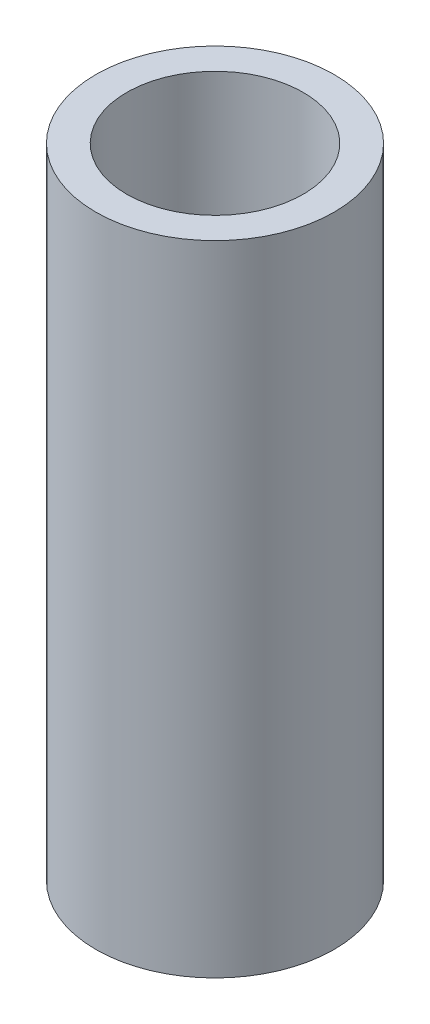
ISO-10303-21;
HEADER;
FILE_DESCRIPTION(('STEP AP214'),'2;1');
FILE_NAME('part.step','',(''),(''),'','','');
FILE_SCHEMA(('AUTOMOTIVE_DESIGN { 1 0 10303 214 1 1 1 1 }'));
ENDSEC;
DATA;
#1=APPLICATION_CONTEXT('core data for automotive mechanical design processes');
#2=APPLICATION_PROTOCOL_DEFINITION('international standard','automotive_design',2000,#1);
#3=PRODUCT_CONTEXT('',#1,'mechanical');
#4=PRODUCT('Part','Part','',(#3));
#5=PRODUCT_RELATED_PRODUCT_CATEGORY('part','',(#4));
#6=PRODUCT_DEFINITION_FORMATION('','',#4);
#7=PRODUCT_DEFINITION_CONTEXT('part definition',#1,'design');
#8=PRODUCT_DEFINITION('design','',#6,#7);
#9=PRODUCT_DEFINITION_SHAPE('','',#8);
#10=(LENGTH_UNIT() NAMED_UNIT(*) SI_UNIT(.MILLI.,.METRE.));
#11=(NAMED_UNIT(*) PLANE_ANGLE_UNIT() SI_UNIT($,.RADIAN.));
#12=(NAMED_UNIT(*) SI_UNIT($,.STERADIAN.) SOLID_ANGLE_UNIT());
#13=UNCERTAINTY_MEASURE_WITH_UNIT(LENGTH_MEASURE(1.E-05),#10,'distance_accuracy_value','');
#14=(GEOMETRIC_REPRESENTATION_CONTEXT(3) GLOBAL_UNCERTAINTY_ASSIGNED_CONTEXT((#13)) GLOBAL_UNIT_ASSIGNED_CONTEXT((#10,
#11,#12)) REPRESENTATION_CONTEXT('',''));
#15=CARTESIAN_POINT('',(0.,0.,0.));
#16=DIRECTION('',(0.,0.,1.));
#17=DIRECTION('',(1.,0.,0.));
#18=AXIS2_PLACEMENT_3D('',#15,#16,#17);
#19=CARTESIAN_POINT('',(0.,57.15,0.));
#20=DIRECTION('',(0.,1.,0.));
#21=DIRECTION('',(0.,0.,1.));
#22=AXIS2_PLACEMENT_3D('',#19,#20,#21);
#23=PLANE('',#22);
#24=CARTESIAN_POINT('',(0.,57.15,0.));
#25=DIRECTION('',(0.,1.,0.));
#26=DIRECTION('',(0.,0.,1.));
#27=AXIS2_PLACEMENT_3D('',#24,#25,#26);
#28=CIRCLE('',#27,10.668);
#29=CARTESIAN_POINT('',(0.,57.15,10.668));
#30=VERTEX_POINT('',#29);
#31=EDGE_CURVE('E10',#30,#30,#28,.T.);
#32=ORIENTED_EDGE('',*,*,#31,.T.);
#33=EDGE_LOOP('',(#32));
#34=FACE_BOUND('',#33,.T.);
#35=CARTESIAN_POINT('',(0.,57.15,0.));
#36=DIRECTION('',(0.,1.,0.));
#37=DIRECTION('',(0.,0.,1.));
#38=AXIS2_PLACEMENT_3D('',#35,#36,#37);
#39=CIRCLE('',#38,7.8994);
#40=CARTESIAN_POINT('',(0.,57.15,7.8994));
#41=VERTEX_POINT('',#40);
#42=EDGE_CURVE('E54',#41,#41,#39,.T.);
#43=ORIENTED_EDGE('',*,*,#42,.F.);
#44=EDGE_LOOP('',(#43));
#45=FACE_BOUND('',#44,.T.);
#46=ADVANCED_FACE('F41',(#34,#45),#23,.T.);
#47=CARTESIAN_POINT('',(0.,0.,0.));
#48=DIRECTION('',(0.,1.,0.));
#49=DIRECTION('',(0.,0.,1.));
#50=AXIS2_PLACEMENT_3D('',#47,#48,#49);
#51=PLANE('',#50);
#52=CARTESIAN_POINT('',(0.,0.,0.));
#53=DIRECTION('',(0.,1.,0.));
#54=DIRECTION('',(0.,0.,1.));
#55=AXIS2_PLACEMENT_3D('',#52,#53,#54);
#56=CIRCLE('',#55,10.668);
#57=CARTESIAN_POINT('',(0.,0.,10.668));
#58=VERTEX_POINT('',#57);
#59=EDGE_CURVE('E45',#58,#58,#56,.T.);
#60=ORIENTED_EDGE('',*,*,#59,.F.);
#61=EDGE_LOOP('',(#60));
#62=FACE_BOUND('',#61,.T.);
#63=CARTESIAN_POINT('',(0.,0.,0.));
#64=DIRECTION('',(0.,1.,0.));
#65=DIRECTION('',(0.,0.,1.));
#66=AXIS2_PLACEMENT_3D('',#63,#64,#65);
#67=CIRCLE('',#66,7.8994);
#68=CARTESIAN_POINT('',(0.,0.,7.8994));
#69=VERTEX_POINT('',#68);
#70=EDGE_CURVE('E56',#69,#69,#67,.T.);
#71=ORIENTED_EDGE('',*,*,#70,.T.);
#72=EDGE_LOOP('',(#71));
#73=FACE_BOUND('',#72,.T.);
#74=ADVANCED_FACE('F68',(#62,#73),#51,.F.);
#75=CARTESIAN_POINT('',(0.,57.15,0.));
#76=DIRECTION('',(0.,-1.,0.));
#77=DIRECTION('',(0.,0.,-1.));
#78=AXIS2_PLACEMENT_3D('',#75,#76,#77);
#79=CYLINDRICAL_SURFACE('',#78,10.668);
#80=ORIENTED_EDGE('',*,*,#31,.F.);
#81=EDGE_LOOP('',(#80));
#82=FACE_BOUND('',#81,.T.);
#83=ORIENTED_EDGE('',*,*,#59,.T.);
#84=EDGE_LOOP('',(#83));
#85=FACE_BOUND('',#84,.T.);
#86=ADVANCED_FACE('F43',(#82,#85),#79,.T.);
#87=CARTESIAN_POINT('',(0.,57.15,0.));
#88=DIRECTION('',(0.,-1.,0.));
#89=DIRECTION('',(0.,0.,-1.));
#90=AXIS2_PLACEMENT_3D('',#87,#88,#89);
#91=CYLINDRICAL_SURFACE('',#90,7.8994);
#92=ORIENTED_EDGE('',*,*,#42,.T.);
#93=EDGE_LOOP('',(#92));
#94=FACE_BOUND('',#93,.T.);
#95=ORIENTED_EDGE('',*,*,#70,.F.);
#96=EDGE_LOOP('',(#95));
#97=FACE_BOUND('',#96,.T.);
#98=ADVANCED_FACE('F64',(#94,#97),#91,.F.);
#99=CLOSED_SHELL('',(#46,#74,#86,#98));
#100=MANIFOLD_SOLID_BREP('B2',#99);
#101=ADVANCED_BREP_SHAPE_REPRESENTATION('',(#18,#100),#14);
#102=SHAPE_DEFINITION_REPRESENTATION(#9,#101);
ENDSEC;
END-ISO-10303-21;
